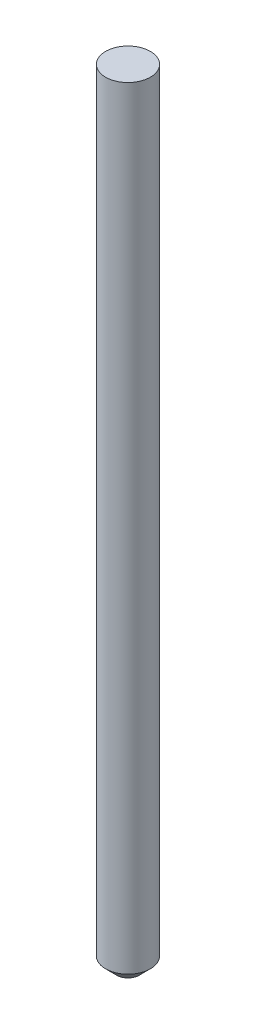
ISO-10303-21;
HEADER;
FILE_DESCRIPTION(('STEP AP214'),'2;1');
FILE_NAME('part.step','',(''),(''),'','','');
FILE_SCHEMA(('AUTOMOTIVE_DESIGN { 1 0 10303 214 1 1 1 1 }'));
ENDSEC;
DATA;
#1=APPLICATION_CONTEXT('core data for automotive mechanical design processes');
#2=APPLICATION_PROTOCOL_DEFINITION('international standard','automotive_design',2000,#1);
#3=PRODUCT_CONTEXT('',#1,'mechanical');
#4=PRODUCT('Part','Part','',(#3));
#5=PRODUCT_RELATED_PRODUCT_CATEGORY('part','',(#4));
#6=PRODUCT_DEFINITION_FORMATION('','',#4);
#7=PRODUCT_DEFINITION_CONTEXT('part definition',#1,'design');
#8=PRODUCT_DEFINITION('design','',#6,#7);
#9=PRODUCT_DEFINITION_SHAPE('','',#8);
#10=(LENGTH_UNIT() NAMED_UNIT(*) SI_UNIT(.MILLI.,.METRE.));
#11=(NAMED_UNIT(*) PLANE_ANGLE_UNIT() SI_UNIT($,.RADIAN.));
#12=(NAMED_UNIT(*) SI_UNIT($,.STERADIAN.) SOLID_ANGLE_UNIT());
#13=UNCERTAINTY_MEASURE_WITH_UNIT(LENGTH_MEASURE(1.E-05),#10,'distance_accuracy_value','');
#14=(GEOMETRIC_REPRESENTATION_CONTEXT(3) GLOBAL_UNCERTAINTY_ASSIGNED_CONTEXT((#13)) GLOBAL_UNIT_ASSIGNED_CONTEXT((#10,
#11,#12)) REPRESENTATION_CONTEXT('',''));
#15=CARTESIAN_POINT('',(0.,0.,0.));
#16=DIRECTION('',(0.,0.,1.));
#17=DIRECTION('',(1.,0.,0.));
#18=AXIS2_PLACEMENT_3D('',#15,#16,#17);
#19=CARTESIAN_POINT('',(0.,140.,0.));
#20=DIRECTION('',(0.,-1.,0.));
#21=DIRECTION('',(0.,0.,-1.));
#22=AXIS2_PLACEMENT_3D('',#19,#20,#21);
#23=CYLINDRICAL_SURFACE('',#22,4.);
#24=CARTESIAN_POINT('',(0.,2.,0.));
#25=DIRECTION('',(0.,1.,0.));
#26=DIRECTION('',(0.,0.,1.));
#27=AXIS2_PLACEMENT_3D('',#24,#25,#26);
#28=CIRCLE('',#27,4.);
#29=CARTESIAN_POINT('',(0.,2.,4.));
#30=VERTEX_POINT('',#29);
#31=EDGE_CURVE('E48',#30,#30,#28,.T.);
#32=ORIENTED_EDGE('',*,*,#31,.T.);
#33=EDGE_LOOP('',(#32));
#34=FACE_BOUND('',#33,.T.);
#35=CARTESIAN_POINT('',(0.,140.,0.));
#36=DIRECTION('',(0.,1.,0.));
#37=DIRECTION('',(0.,0.,1.));
#38=AXIS2_PLACEMENT_3D('',#35,#36,#37);
#39=CIRCLE('',#38,4.);
#40=CARTESIAN_POINT('',(0.,140.,4.));
#41=VERTEX_POINT('',#40);
#42=EDGE_CURVE('E53',#41,#41,#39,.T.);
#43=ORIENTED_EDGE('',*,*,#42,.F.);
#44=EDGE_LOOP('',(#43));
#45=FACE_BOUND('',#44,.T.);
#46=ADVANCED_FACE('F39',(#34,#45),#23,.T.);
#47=CARTESIAN_POINT('',(0.,140.,0.));
#48=DIRECTION('',(0.,1.,0.));
#49=DIRECTION('',(0.,0.,1.));
#50=AXIS2_PLACEMENT_3D('',#47,#48,#49);
#51=PLANE('',#50);
#52=ORIENTED_EDGE('',*,*,#42,.T.);
#53=EDGE_LOOP('',(#52));
#54=FACE_BOUND('',#53,.T.);
#55=ADVANCED_FACE('F61',(#54),#51,.T.);
#56=CARTESIAN_POINT('',(0.,0.,0.));
#57=DIRECTION('',(0.,1.,0.));
#58=DIRECTION('',(0.,0.,1.));
#59=AXIS2_PLACEMENT_3D('',#56,#57,#58);
#60=PLANE('',#59);
#61=CARTESIAN_POINT('',(0.,0.,0.));
#62=DIRECTION('',(0.,1.,0.));
#63=DIRECTION('',(0.,0.,1.));
#64=AXIS2_PLACEMENT_3D('',#61,#62,#63);
#65=CIRCLE('',#64,2.);
#66=CARTESIAN_POINT('',(0.,0.,2.));
#67=VERTEX_POINT('',#66);
#68=EDGE_CURVE('E10',#67,#67,#65,.F.);
#69=ORIENTED_EDGE('',*,*,#68,.T.);
#70=EDGE_LOOP('',(#69));
#71=FACE_BOUND('',#70,.T.);
#72=ADVANCED_FACE('F67',(#71),#60,.F.);
#73=CARTESIAN_POINT('',(0.,2.,0.));
#74=DIRECTION('',(0.,1.,0.));
#75=DIRECTION('',(0.,0.,1.));
#76=AXIS2_PLACEMENT_3D('',#73,#74,#75);
#77=CONICAL_SURFACE('',#76,4.,0.785398163397447);
#78=ORIENTED_EDGE('',*,*,#68,.F.);
#79=EDGE_LOOP('',(#78));
#80=FACE_BOUND('',#79,.T.);
#81=ORIENTED_EDGE('',*,*,#31,.F.);
#82=EDGE_LOOP('',(#81));
#83=FACE_BOUND('',#82,.T.);
#84=ADVANCED_FACE('F42',(#80,#83),#77,.T.);
#85=CLOSED_SHELL('',(#46,#55,#72,#84));
#86=MANIFOLD_SOLID_BREP('B2',#85);
#87=ADVANCED_BREP_SHAPE_REPRESENTATION('',(#18,#86),#14);
#88=SHAPE_DEFINITION_REPRESENTATION(#9,#87);
ENDSEC;
END-ISO-10303-21;
